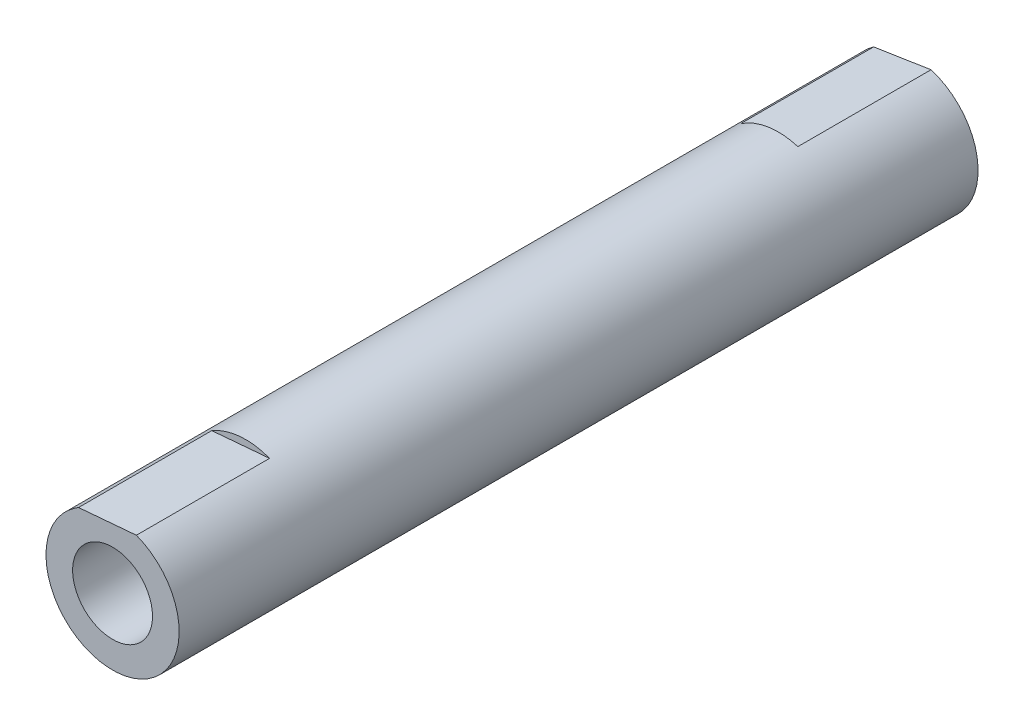
ISO-10303-21;
HEADER;
FILE_DESCRIPTION(('STEP AP214'),'2;1');
FILE_NAME('part.step','',(''),(''),'','','');
FILE_SCHEMA(('AUTOMOTIVE_DESIGN { 1 0 10303 214 1 1 1 1 }'));
ENDSEC;
DATA;
#1=APPLICATION_CONTEXT('core data for automotive mechanical design processes');
#2=APPLICATION_PROTOCOL_DEFINITION('international standard','automotive_design',2000,#1);
#3=PRODUCT_CONTEXT('',#1,'mechanical');
#4=PRODUCT('Part','Part','',(#3));
#5=PRODUCT_RELATED_PRODUCT_CATEGORY('part','',(#4));
#6=PRODUCT_DEFINITION_FORMATION('','',#4);
#7=PRODUCT_DEFINITION_CONTEXT('part definition',#1,'design');
#8=PRODUCT_DEFINITION('design','',#6,#7);
#9=PRODUCT_DEFINITION_SHAPE('','',#8);
#10=(LENGTH_UNIT() NAMED_UNIT(*) SI_UNIT(.MILLI.,.METRE.));
#11=(NAMED_UNIT(*) PLANE_ANGLE_UNIT() SI_UNIT($,.RADIAN.));
#12=(NAMED_UNIT(*) SI_UNIT($,.STERADIAN.) SOLID_ANGLE_UNIT());
#13=UNCERTAINTY_MEASURE_WITH_UNIT(LENGTH_MEASURE(1.E-05),#10,'distance_accuracy_value','');
#14=(GEOMETRIC_REPRESENTATION_CONTEXT(3) GLOBAL_UNCERTAINTY_ASSIGNED_CONTEXT((#13)) GLOBAL_UNIT_ASSIGNED_CONTEXT((#10,
#11,#12)) REPRESENTATION_CONTEXT('',''));
#15=CARTESIAN_POINT('',(0.,0.,0.));
#16=DIRECTION('',(0.,0.,1.));
#17=DIRECTION('',(1.,0.,0.));
#18=AXIS2_PLACEMENT_3D('',#15,#16,#17);
#19=CARTESIAN_POINT('',(0.,0.,30.));
#20=DIRECTION('',(0.,0.,1.));
#21=DIRECTION('',(1.,0.,0.));
#22=AXIS2_PLACEMENT_3D('',#19,#20,#21);
#23=PLANE('',#22);
#24=DIRECTION('',(0.996404212619664,0.0847268851887538,0.));
#25=VECTOR('',#24,1.);
#26=CARTESIAN_POINT('',(-2.55288361821305,4.29916099161911,30.));
#27=LINE('',#26,#25);
#28=CARTESIAN_POINT('',(-2.55288361821305,4.29916099161911,30.));
#29=VERTEX_POINT('',#28);
#30=CARTESIAN_POINT('',(1.79034165151427,4.66847692195786,30.));
#31=VERTEX_POINT('',#30);
#32=EDGE_CURVE('E87',#29,#31,#27,.T.);
#33=ORIENTED_EDGE('',*,*,#32,.F.);
#34=CARTESIAN_POINT('',(0.,0.,30.));
#35=DIRECTION('',(0.,0.,1.));
#36=DIRECTION('',(1.,0.,0.));
#37=AXIS2_PLACEMENT_3D('',#34,#35,#36);
#38=CIRCLE('',#37,5.);
#39=EDGE_CURVE('E11',#29,#31,#38,.T.);
#40=ORIENTED_EDGE('',*,*,#39,.T.);
#41=EDGE_LOOP('',(#33,#40));
#42=FACE_BOUND('',#41,.T.);
#43=CARTESIAN_POINT('',(0.,0.,30.));
#44=DIRECTION('',(0.,0.,1.));
#45=DIRECTION('',(1.,0.,0.));
#46=AXIS2_PLACEMENT_3D('',#43,#44,#45);
#47=CIRCLE('',#46,3.);
#48=CARTESIAN_POINT('',(3.,0.,30.));
#49=VERTEX_POINT('',#48);
#50=EDGE_CURVE('E102',#49,#49,#47,.T.);
#51=ORIENTED_EDGE('',*,*,#50,.F.);
#52=EDGE_LOOP('',(#51));
#53=FACE_BOUND('',#52,.T.);
#54=ADVANCED_FACE('F33',(#42,#53),#23,.T.);
#55=CARTESIAN_POINT('',(0.,0.,-30.));
#56=DIRECTION('',(0.,0.,1.));
#57=DIRECTION('',(1.,0.,0.));
#58=AXIS2_PLACEMENT_3D('',#55,#56,#57);
#59=PLANE('',#58);
#60=CARTESIAN_POINT('',(0.,0.,-30.));
#61=DIRECTION('',(0.,0.,1.));
#62=DIRECTION('',(1.,0.,0.));
#63=AXIS2_PLACEMENT_3D('',#60,#61,#62);
#64=CIRCLE('',#63,5.);
#65=CARTESIAN_POINT('',(-2.84151833669805,4.11409449845392,-30.));
#66=VERTEX_POINT('',#65);
#67=CARTESIAN_POINT('',(1.46618462057592,4.78019901870065,-30.));
#68=VERTEX_POINT('',#67);
#69=EDGE_CURVE('E37',#66,#68,#64,.T.);
#70=ORIENTED_EDGE('',*,*,#69,.F.);
#71=DIRECTION('',(-0.988254835239396,-0.152814857346903,0.));
#72=VECTOR('',#71,1.);
#73=CARTESIAN_POINT('',(1.46618462057592,4.78019901870065,-30.));
#74=LINE('',#73,#72);
#75=EDGE_CURVE('E80',#68,#66,#74,.T.);
#76=ORIENTED_EDGE('',*,*,#75,.F.);
#77=EDGE_LOOP('',(#70,#76));
#78=FACE_BOUND('',#77,.T.);
#79=CARTESIAN_POINT('',(0.,0.,-30.));
#80=DIRECTION('',(0.,0.,1.));
#81=DIRECTION('',(1.,0.,0.));
#82=AXIS2_PLACEMENT_3D('',#79,#80,#81);
#83=CIRCLE('',#82,3.);
#84=CARTESIAN_POINT('',(3.,0.,-30.));
#85=VERTEX_POINT('',#84);
#86=EDGE_CURVE('E100',#85,#85,#83,.T.);
#87=ORIENTED_EDGE('',*,*,#86,.T.);
#88=EDGE_LOOP('',(#87));
#89=FACE_BOUND('',#88,.T.);
#90=ADVANCED_FACE('F108',(#78,#89),#59,.F.);
#91=CARTESIAN_POINT('',(0.,0.,30.));
#92=DIRECTION('',(0.,0.,-1.));
#93=DIRECTION('',(-1.,0.,0.));
#94=AXIS2_PLACEMENT_3D('',#91,#92,#93);
#95=CYLINDRICAL_SURFACE('',#94,5.);
#96=ORIENTED_EDGE('',*,*,#39,.F.);
#97=DIRECTION('',(0.,0.,1.));
#98=VECTOR('',#97,1.);
#99=CARTESIAN_POINT('',(-2.55288361821305,4.29916099161911,20.));
#100=LINE('',#99,#98);
#101=CARTESIAN_POINT('',(-2.55288361821305,4.29916099161911,20.));
#102=VERTEX_POINT('',#101);
#103=EDGE_CURVE('E95',#102,#29,#100,.T.);
#104=ORIENTED_EDGE('',*,*,#103,.F.);
#105=CARTESIAN_POINT('',(0.,0.,20.));
#106=DIRECTION('',(0.,0.,1.));
#107=DIRECTION('',(1.,0.,0.));
#108=AXIS2_PLACEMENT_3D('',#105,#106,#107);
#109=CIRCLE('',#108,5.);
#110=CARTESIAN_POINT('',(1.79034165151427,4.66847692195786,20.));
#111=VERTEX_POINT('',#110);
#112=EDGE_CURVE('E89',#111,#102,#109,.T.);
#113=ORIENTED_EDGE('',*,*,#112,.F.);
#114=DIRECTION('',(0.,0.,1.));
#115=VECTOR('',#114,1.);
#116=CARTESIAN_POINT('',(1.79034165151427,4.66847692195786,20.));
#117=LINE('',#116,#115);
#118=EDGE_CURVE('E97',#111,#31,#117,.T.);
#119=ORIENTED_EDGE('',*,*,#118,.T.);
#120=EDGE_LOOP('',(#96,#104,#113,#119));
#121=FACE_BOUND('',#120,.T.);
#122=CARTESIAN_POINT('',(0.,0.,-20.));
#123=DIRECTION('',(0.,0.,-1.));
#124=DIRECTION('',(-1.,0.,0.));
#125=AXIS2_PLACEMENT_3D('',#122,#123,#124);
#126=CIRCLE('',#125,5.);
#127=CARTESIAN_POINT('',(-2.84151833669805,4.11409449845391,-20.));
#128=VERTEX_POINT('',#127);
#129=CARTESIAN_POINT('',(1.46618462057592,4.78019901870065,-20.));
#130=VERTEX_POINT('',#129);
#131=EDGE_CURVE('E79',#128,#130,#126,.T.);
#132=ORIENTED_EDGE('',*,*,#131,.F.);
#133=DIRECTION('',(0.,0.,-1.));
#134=VECTOR('',#133,1.);
#135=CARTESIAN_POINT('',(-2.84151833669805,4.11409449845392,-20.));
#136=LINE('',#135,#134);
#137=EDGE_CURVE('E77',#128,#66,#136,.T.);
#138=ORIENTED_EDGE('',*,*,#137,.T.);
#139=ORIENTED_EDGE('',*,*,#69,.T.);
#140=DIRECTION('',(0.,0.,-1.));
#141=VECTOR('',#140,1.);
#142=CARTESIAN_POINT('',(1.46618462057592,4.78019901870065,-20.));
#143=LINE('',#142,#141);
#144=EDGE_CURVE('E74',#130,#68,#143,.T.);
#145=ORIENTED_EDGE('',*,*,#144,.F.);
#146=EDGE_LOOP('',(#132,#138,#139,#145));
#147=FACE_BOUND('',#146,.T.);
#148=ADVANCED_FACE('F35',(#121,#147),#95,.T.);
#149=CARTESIAN_POINT('',(0.,0.,30.));
#150=DIRECTION('',(0.,0.,-1.));
#151=DIRECTION('',(-1.,0.,0.));
#152=AXIS2_PLACEMENT_3D('',#149,#150,#151);
#153=CYLINDRICAL_SURFACE('',#152,3.);
#154=ORIENTED_EDGE('',*,*,#50,.T.);
#155=EDGE_LOOP('',(#154));
#156=FACE_BOUND('',#155,.T.);
#157=ORIENTED_EDGE('',*,*,#86,.F.);
#158=EDGE_LOOP('',(#157));
#159=FACE_BOUND('',#158,.T.);
#160=ADVANCED_FACE('F110',(#156,#159),#153,.F.);
#161=CARTESIAN_POINT('',(-2.55288361821305,4.29916099161911,20.));
#162=DIRECTION('',(0.0847268851887538,-0.996404212619664,0.));
#163=DIRECTION('',(0.996404212619664,0.0847268851887538,0.));
#164=AXIS2_PLACEMENT_3D('',#161,#162,#163);
#165=PLANE('',#164);
#166=ORIENTED_EDGE('',*,*,#32,.T.);
#167=ORIENTED_EDGE('',*,*,#118,.F.);
#168=DIRECTION('',(0.996404212619664,0.0847268851887538,0.));
#169=VECTOR('',#168,1.);
#170=CARTESIAN_POINT('',(-2.55288361821305,4.29916099161911,20.));
#171=LINE('',#170,#169);
#172=EDGE_CURVE('E54',#102,#111,#171,.T.);
#173=ORIENTED_EDGE('',*,*,#172,.F.);
#174=ORIENTED_EDGE('',*,*,#103,.T.);
#175=EDGE_LOOP('',(#166,#167,#173,#174));
#176=FACE_BOUND('',#175,.T.);
#177=ADVANCED_FACE('F112',(#176),#165,.F.);
#178=CARTESIAN_POINT('',(0.,0.,20.));
#179=DIRECTION('',(0.,0.,1.));
#180=DIRECTION('',(1.,0.,0.));
#181=AXIS2_PLACEMENT_3D('',#178,#179,#180);
#182=PLANE('',#181);
#183=ORIENTED_EDGE('',*,*,#112,.T.);
#184=ORIENTED_EDGE('',*,*,#172,.T.);
#185=EDGE_LOOP('',(#183,#184));
#186=FACE_BOUND('',#185,.T.);
#187=ADVANCED_FACE('F119',(#186),#182,.T.);
#188=CARTESIAN_POINT('',(1.46618462057592,4.78019901870065,-20.));
#189=DIRECTION('',(0.152814857346903,-0.988254835239396,0.));
#190=DIRECTION('',(0.988254835239396,0.152814857346903,0.));
#191=AXIS2_PLACEMENT_3D('',#188,#189,#190);
#192=PLANE('',#191);
#193=ORIENTED_EDGE('',*,*,#75,.T.);
#194=ORIENTED_EDGE('',*,*,#137,.F.);
#195=DIRECTION('',(-0.988254835239396,-0.152814857346903,0.));
#196=VECTOR('',#195,1.);
#197=CARTESIAN_POINT('',(1.46618462057592,4.78019901870065,-20.));
#198=LINE('',#197,#196);
#199=EDGE_CURVE('E47',#130,#128,#198,.T.);
#200=ORIENTED_EDGE('',*,*,#199,.F.);
#201=ORIENTED_EDGE('',*,*,#144,.T.);
#202=EDGE_LOOP('',(#193,#194,#200,#201));
#203=FACE_BOUND('',#202,.T.);
#204=ADVANCED_FACE('F72',(#203),#192,.F.);
#205=CARTESIAN_POINT('',(0.,0.,-20.));
#206=DIRECTION('',(0.,0.,-1.));
#207=DIRECTION('',(-1.,0.,0.));
#208=AXIS2_PLACEMENT_3D('',#205,#206,#207);
#209=PLANE('',#208);
#210=ORIENTED_EDGE('',*,*,#199,.T.);
#211=ORIENTED_EDGE('',*,*,#131,.T.);
#212=EDGE_LOOP('',(#210,#211));
#213=FACE_BOUND('',#212,.T.);
#214=ADVANCED_FACE('F82',(#213),#209,.T.);
#215=CLOSED_SHELL('',(#54,#90,#148,#160,#177,#187,#204,#214));
#216=MANIFOLD_SOLID_BREP('B2',#215);
#217=ADVANCED_BREP_SHAPE_REPRESENTATION('',(#18,#216),#14);
#218=SHAPE_DEFINITION_REPRESENTATION(#9,#217);
ENDSEC;
END-ISO-10303-21;
